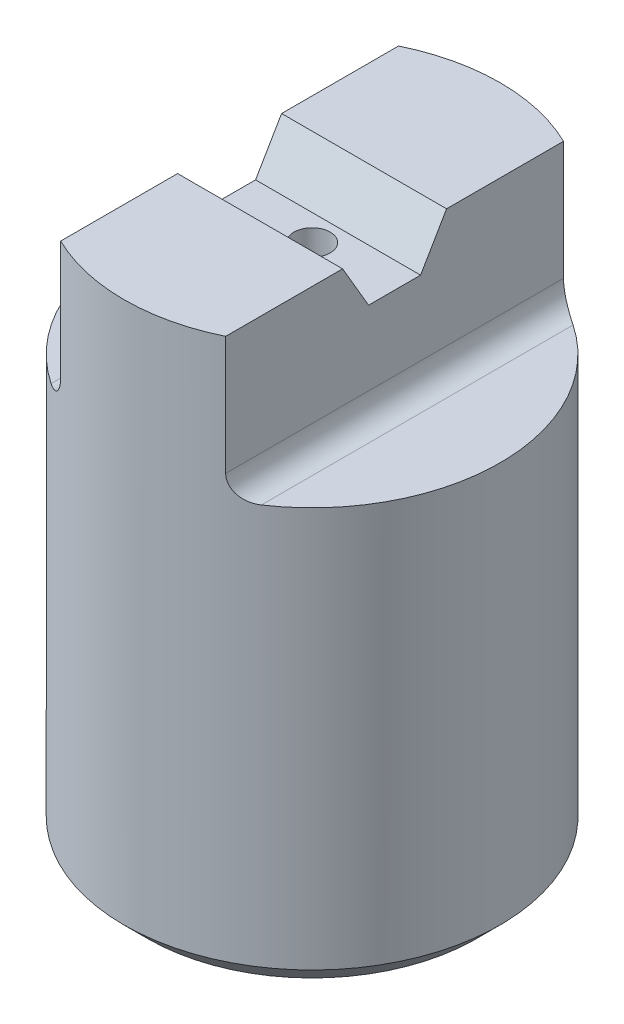
ISO-10303-21;
HEADER;
FILE_DESCRIPTION(('STEP AP214'),'2;1');
FILE_NAME('part.step','',(''),(''),'','','');
FILE_SCHEMA(('AUTOMOTIVE_DESIGN { 1 0 10303 214 1 1 1 1 }'));
ENDSEC;
DATA;
#1=APPLICATION_CONTEXT('core data for automotive mechanical design processes');
#2=APPLICATION_PROTOCOL_DEFINITION('international standard','automotive_design',2000,#1);
#3=PRODUCT_CONTEXT('',#1,'mechanical');
#4=PRODUCT('Part','Part','',(#3));
#5=PRODUCT_RELATED_PRODUCT_CATEGORY('part','',(#4));
#6=PRODUCT_DEFINITION_FORMATION('','',#4);
#7=PRODUCT_DEFINITION_CONTEXT('part definition',#1,'design');
#8=PRODUCT_DEFINITION('design','',#6,#7);
#9=PRODUCT_DEFINITION_SHAPE('','',#8);
#10=(LENGTH_UNIT() NAMED_UNIT(*) SI_UNIT(.MILLI.,.METRE.));
#11=(NAMED_UNIT(*) PLANE_ANGLE_UNIT() SI_UNIT($,.RADIAN.));
#12=(NAMED_UNIT(*) SI_UNIT($,.STERADIAN.) SOLID_ANGLE_UNIT());
#13=UNCERTAINTY_MEASURE_WITH_UNIT(LENGTH_MEASURE(1.E-05),#10,'distance_accuracy_value','');
#14=(GEOMETRIC_REPRESENTATION_CONTEXT(3) GLOBAL_UNCERTAINTY_ASSIGNED_CONTEXT((#13)) GLOBAL_UNIT_ASSIGNED_CONTEXT((#10,
#11,#12)) REPRESENTATION_CONTEXT('',''));
#15=CARTESIAN_POINT('',(0.,0.,0.));
#16=DIRECTION('',(0.,0.,1.));
#17=DIRECTION('',(1.,0.,0.));
#18=AXIS2_PLACEMENT_3D('',#15,#16,#17);
#19=CARTESIAN_POINT('',(0.,38.1,0.));
#20=DIRECTION('',(0.,1.,0.));
#21=DIRECTION('',(0.,0.,1.));
#22=AXIS2_PLACEMENT_3D('',#19,#20,#21);
#23=PLANE('',#22);
#24=DIRECTION('',(0.,0.,1.));
#25=VECTOR('',#24,1.);
#26=CARTESIAN_POINT('',(-5.5626,38.1,-12.6746));
#27=LINE('',#26,#25);
#28=CARTESIAN_POINT('',(-5.5626,38.1,3.50519999999999));
#29=VERTEX_POINT('',#28);
#30=CARTESIAN_POINT('',(-5.5626,38.1,11.3887210168658));
#31=VERTEX_POINT('',#30);
#32=EDGE_CURVE('E223',#29,#31,#27,.T.);
#33=ORIENTED_EDGE('',*,*,#32,.T.);
#34=CARTESIAN_POINT('',(0.,38.1,0.));
#35=DIRECTION('',(0.,1.,0.));
#36=DIRECTION('',(0.,0.,1.));
#37=AXIS2_PLACEMENT_3D('',#34,#35,#36);
#38=CIRCLE('',#37,12.6746);
#39=CARTESIAN_POINT('',(5.5626,38.1,11.3887210168658));
#40=VERTEX_POINT('',#39);
#41=EDGE_CURVE('E146',#31,#40,#38,.T.);
#42=ORIENTED_EDGE('',*,*,#41,.T.);
#43=DIRECTION('',(0.,0.,1.));
#44=VECTOR('',#43,1.);
#45=CARTESIAN_POINT('',(5.5626,38.1,-12.6746));
#46=LINE('',#45,#44);
#47=CARTESIAN_POINT('',(5.5626,38.1,3.50519999999998));
#48=VERTEX_POINT('',#47);
#49=EDGE_CURVE('E139',#48,#40,#46,.T.);
#50=ORIENTED_EDGE('',*,*,#49,.F.);
#51=DIRECTION('',(1.,0.,0.));
#52=VECTOR('',#51,1.);
#53=CARTESIAN_POINT('',(0.,38.1,3.5052));
#54=LINE('',#53,#52);
#55=EDGE_CURVE('E148',#29,#48,#54,.T.);
#56=ORIENTED_EDGE('',*,*,#55,.F.);
#57=EDGE_LOOP('',(#33,#42,#50,#56));
#58=FACE_BOUND('',#57,.T.);
#59=ADVANCED_FACE('F42',(#58),#23,.T.);
#60=CARTESIAN_POINT('',(0.,38.1,0.));
#61=DIRECTION('',(0.,-1.,0.));
#62=DIRECTION('',(0.,0.,-1.));
#63=AXIS2_PLACEMENT_3D('',#60,#61,#62);
#64=CYLINDRICAL_SURFACE('',#63,12.6746);
#65=CARTESIAN_POINT('',(0.,1.58750000000002,0.));
#66=DIRECTION('',(0.,1.,0.));
#67=DIRECTION('',(0.,0.,1.));
#68=AXIS2_PLACEMENT_3D('',#65,#66,#67);
#69=CIRCLE('',#68,12.6746);
#70=CARTESIAN_POINT('',(0.,1.58750000000002,12.6746));
#71=VERTEX_POINT('',#70);
#72=EDGE_CURVE('E52',#71,#71,#69,.T.);
#73=ORIENTED_EDGE('',*,*,#72,.T.);
#74=EDGE_LOOP('',(#73));
#75=FACE_BOUND('',#74,.T.);
#76=ORIENTED_EDGE('',*,*,#41,.F.);
#77=DIRECTION('',(0.,-1.,0.));
#78=VECTOR('',#77,1.);
#79=CARTESIAN_POINT('',(-5.5626,38.1,11.3887210168658));
#80=LINE('',#79,#78);
#81=CARTESIAN_POINT('',(-5.5626,30.099,11.3887210168658));
#82=VERTEX_POINT('',#81);
#83=EDGE_CURVE('E232',#31,#82,#80,.T.);
#84=ORIENTED_EDGE('',*,*,#83,.T.);
#85=CARTESIAN_POINT('',(-5.5626,30.099,11.3887210168658));
#86=CARTESIAN_POINT('',(-5.56259833638451,30.059515767015,11.3887205754779));
#87=CARTESIAN_POINT('',(-5.56413560332817,30.0200513689779,11.3879711119941));
#88=CARTESIAN_POINT('',(-5.57025538050498,29.9414242916359,11.3849794667979));
#89=CARTESIAN_POINT('',(-5.57483727345219,29.9022615527988,11.3827375876666));
#90=CARTESIAN_POINT('',(-5.59305475937112,29.7858959670763,11.3738039865226));
#91=CARTESIAN_POINT('',(-5.61116273729264,29.7095059860519,11.3649041725664));
#92=CARTESIAN_POINT('',(-5.65849678227894,29.5612633666685,11.341410256651));
#93=CARTESIAN_POINT('',(-5.68771997519488,29.4894095609505,11.3268176267032));
#94=CARTESIAN_POINT('',(-5.75604501274824,29.3519443853424,11.292249187289));
#95=CARTESIAN_POINT('',(-5.79515131147731,29.2863358484557,11.2722709503803));
#96=CARTESIAN_POINT('',(-5.88308811332943,29.1608124494378,11.2266327218898));
#97=CARTESIAN_POINT('',(-5.93219013494768,29.1011475010108,11.2008111347938));
#98=CARTESIAN_POINT('',(-6.03742774124639,28.991020163794,11.1444386632707));
#99=CARTESIAN_POINT('',(-6.09356354650025,28.9405580637194,11.1138876305251));
#100=CARTESIAN_POINT('',(-6.21652492068628,28.8451470604476,11.0456182066125));
#101=CARTESIAN_POINT('',(-6.28385904090425,28.8011429423719,11.0074979274901));
#102=CARTESIAN_POINT('',(-6.42267729153823,28.7249285891421,10.927083790395));
#103=CARTESIAN_POINT('',(-6.49416792756039,28.6927374520347,10.8847833131863));
#104=CARTESIAN_POINT('',(-6.65217713755734,28.6354097201875,10.7890664624693));
#105=CARTESIAN_POINT('',(-6.73912532568312,28.6125133442687,10.7350042920762));
#106=CARTESIAN_POINT('',(-6.86970618567764,28.5898660744945,10.6515401158691));
#107=CARTESIAN_POINT('',(-6.91320985678746,28.584266280002,10.6233570629947));
#108=CARTESIAN_POINT('',(-7.00006441283988,28.5768368460138,10.5663276854651));
#109=CARTESIAN_POINT('',(-7.04341538014501,28.5750047019154,10.537481814335));
#110=CARTESIAN_POINT('',(-7.0866,28.575,10.5083578926491));
#111=B_SPLINE_CURVE_WITH_KNOTS('',3,(#85,#86,#87,#88,#89,#90,#91,#92,#93,#94,#95,#96,#97,#98,
#99,#100,#101,#102,#103,#104,#105,#106,#107,#108,#109,#110),.UNSPECIFIED.,.F.,.F.,(4,2,2,2,2,2,
2,2,2,2,2,2,4),(0.,0.118376723226393,0.236729453358002,0.472517961760287,0.708245541870998,
0.944079549098627,1.1874729457039,1.43087397682821,1.69683953271511,1.96323320027045,
2.27653340150419,2.4328273576759,2.5890173814408),.UNSPECIFIED.);
#112=CARTESIAN_POINT('',(-7.0866,28.575,10.5083578926491));
#113=VERTEX_POINT('',#112);
#114=EDGE_CURVE('E270',#82,#113,#111,.T.);
#115=ORIENTED_EDGE('',*,*,#114,.T.);
#116=CARTESIAN_POINT('',(0.,28.575,0.));
#117=DIRECTION('',(0.,-1.,0.));
#118=DIRECTION('',(1.,0.,0.));
#119=AXIS2_PLACEMENT_3D('',#116,#117,#118);
#120=CIRCLE('',#119,12.6746);
#121=CARTESIAN_POINT('',(-7.0866,28.575,-10.5083578926491));
#122=VERTEX_POINT('',#121);
#123=EDGE_CURVE('E267',#113,#122,#120,.T.);
#124=ORIENTED_EDGE('',*,*,#123,.T.);
#125=CARTESIAN_POINT('',(-7.0866,28.575,-10.5083578926491));
#126=CARTESIAN_POINT('',(-7.03284130686239,28.5749999917076,-10.5446189155192));
#127=CARTESIAN_POINT('',(-6.97878106168281,28.5778454608532,-10.580468507141));
#128=CARTESIAN_POINT('',(-6.87048486278435,28.5894168850708,-10.651106419884));
#129=CARTESIAN_POINT('',(-6.81624876727833,28.598151595978,-10.6858930800772));
#130=CARTESIAN_POINT('',(-6.70798914272899,28.6217362112059,-10.7541845715569));
#131=CARTESIAN_POINT('',(-6.65396717063229,28.6366088965979,-10.7876841139555));
#132=CARTESIAN_POINT('',(-6.5470188162544,28.672601753039,-10.852923770536));
#133=CARTESIAN_POINT('',(-6.49409164261747,28.6937172297943,-10.884665185531));
#134=CARTESIAN_POINT('',(-6.36588211082076,28.7535666299149,-10.960329132554));
#135=CARTESIAN_POINT('',(-6.29156872215907,28.7959332982983,-11.0031042762727));
#136=CARTESIAN_POINT('',(-6.14940442969504,28.8941404291546,-11.0831839505768));
#137=CARTESIAN_POINT('',(-6.08153932056011,28.9499502697824,-11.1205006087666));
#138=CARTESIAN_POINT('',(-5.95452247637238,29.0748160674812,-11.1890300303333));
#139=CARTESIAN_POINT('',(-5.8954288225175,29.1439539063532,-11.2202025191228));
#140=CARTESIAN_POINT('',(-5.78948590066053,29.2937221536138,-11.2752349871294));
#141=CARTESIAN_POINT('',(-5.74264016011602,29.374355862558,-11.2990928600431));
#142=CARTESIAN_POINT('',(-5.66825012242804,29.5352154478988,-11.3365768771207));
#143=CARTESIAN_POINT('',(-5.63916479372903,29.614539499369,-11.3510313651414));
#144=CARTESIAN_POINT('',(-5.5944662508826,29.7777071267501,-11.3731292161673));
#145=CARTESIAN_POINT('',(-5.57882209477686,29.8615398478591,-11.3807882238962));
#146=CARTESIAN_POINT('',(-5.56772429167455,29.9715216320686,-11.3862168065965));
#147=CARTESIAN_POINT('',(-5.56580237104648,29.996990583067,-11.387156340307));
#148=CARTESIAN_POINT('',(-5.56324214096757,30.0479689785512,-11.3884075143877));
#149=CARTESIAN_POINT('',(-5.56260185827255,30.0734783001781,-11.3887201199946));
#150=CARTESIAN_POINT('',(-5.56259999999999,30.099,-11.3887210168659));
#151=B_SPLINE_CURVE_WITH_KNOTS('',3,(#125,#126,#127,#128,#129,#130,#131,#132,#133,#134,#135,
#136,#137,#138,#139,#140,#141,#142,#143,#144,#145,#146,#147,#148,#149,#150),.UNSPECIFIED.,.F.,
.F.,(4,2,2,2,2,2,2,2,2,2,2,2,4),(0.,0.194499746734342,0.389289305653212,0.584808421543954,
0.780180888319562,1.06581600208983,1.35080652783429,1.63760718336099,1.92449034808457,
2.18029987365551,2.43551892847972,2.51216747465927,2.58869791962831),.UNSPECIFIED.);
#152=CARTESIAN_POINT('',(-5.5626,30.099,-11.3887210168658));
#153=VERTEX_POINT('',#152);
#154=EDGE_CURVE('E269',#122,#153,#151,.T.);
#155=ORIENTED_EDGE('',*,*,#154,.T.);
#156=DIRECTION('',(0.,-1.,0.));
#157=VECTOR('',#156,1.);
#158=CARTESIAN_POINT('',(-5.5626,38.1,-11.3887210168658));
#159=LINE('',#158,#157);
#160=CARTESIAN_POINT('',(-5.5626,38.1,-11.3887210168658));
#161=VERTEX_POINT('',#160);
#162=EDGE_CURVE('E145',#153,#161,#159,.F.);
#163=ORIENTED_EDGE('',*,*,#162,.T.);
#164=CARTESIAN_POINT('',(5.5626,38.1,-11.3887210168658));
#165=VERTEX_POINT('',#164);
#166=EDGE_CURVE('E135',#165,#161,#38,.T.);
#167=ORIENTED_EDGE('',*,*,#166,.F.);
#168=DIRECTION('',(0.,-1.,0.));
#169=VECTOR('',#168,1.);
#170=CARTESIAN_POINT('',(5.5626,38.1,-11.3887210168658));
#171=LINE('',#170,#169);
#172=CARTESIAN_POINT('',(5.5626,30.099,-11.3887210168658));
#173=VERTEX_POINT('',#172);
#174=EDGE_CURVE('E121',#165,#173,#171,.T.);
#175=ORIENTED_EDGE('',*,*,#174,.T.);
#176=CARTESIAN_POINT('',(5.56259999999999,30.099,-11.3887210168658));
#177=CARTESIAN_POINT('',(5.56259833638451,30.059515767015,-11.3887205754778));
#178=CARTESIAN_POINT('',(5.56413560332816,30.0200513689778,-11.3879711119941));
#179=CARTESIAN_POINT('',(5.57025538050497,29.9414242916359,-11.3849794667979));
#180=CARTESIAN_POINT('',(5.57483727345218,29.9022615527988,-11.3827375876666));
#181=CARTESIAN_POINT('',(5.59305475937111,29.7858959670763,-11.3738039865226));
#182=CARTESIAN_POINT('',(5.61116273729264,29.7095059860518,-11.3649041725664));
#183=CARTESIAN_POINT('',(5.65849678227894,29.5612633666685,-11.341410256651));
#184=CARTESIAN_POINT('',(5.68771997519487,29.4894095609505,-11.3268176267032));
#185=CARTESIAN_POINT('',(5.75604501274823,29.3519443853424,-11.292249187289));
#186=CARTESIAN_POINT('',(5.7951513114773,29.2863358484557,-11.2722709503803));
#187=CARTESIAN_POINT('',(5.88308811332942,29.1608124494378,-11.2266327218898));
#188=CARTESIAN_POINT('',(5.93219013494768,29.1011475010108,-11.2008111347938));
#189=CARTESIAN_POINT('',(6.03742774124638,28.991020163794,-11.1444386632707));
#190=CARTESIAN_POINT('',(6.09356354650024,28.9405580637194,-11.1138876305251));
#191=CARTESIAN_POINT('',(6.21652492068628,28.8451470604476,-11.0456182066125));
#192=CARTESIAN_POINT('',(6.28385904090425,28.8011429423718,-11.0074979274902));
#193=CARTESIAN_POINT('',(6.42267729153823,28.7249285891421,-10.927083790395));
#194=CARTESIAN_POINT('',(6.49416792756039,28.6927374520347,-10.8847833131863));
#195=CARTESIAN_POINT('',(6.65217713755733,28.6354097201874,-10.7890664624693));
#196=CARTESIAN_POINT('',(6.73912532568312,28.6125133442687,-10.7350042920762));
#197=CARTESIAN_POINT('',(6.86970618567764,28.5898660744945,-10.6515401158691));
#198=CARTESIAN_POINT('',(6.91320985678746,28.584266280002,-10.6233570629947));
#199=CARTESIAN_POINT('',(7.00006441283988,28.5768368460138,-10.5663276854651));
#200=CARTESIAN_POINT('',(7.04341538014501,28.5750047019154,-10.537481814335));
#201=CARTESIAN_POINT('',(7.0866,28.575,-10.5083578926491));
#202=B_SPLINE_CURVE_WITH_KNOTS('',3,(#176,#177,#178,#179,#180,#181,#182,#183,#184,#185,#186,
#187,#188,#189,#190,#191,#192,#193,#194,#195,#196,#197,#198,#199,#200,#201),.UNSPECIFIED.,.F.,
.F.,(4,2,2,2,2,2,2,2,2,2,2,2,4),(0.,0.118376723226393,0.236729453358002,0.472517961760287,
0.708245541870998,0.944079549098627,1.1874729457039,1.43087397682821,1.69683953271511,
1.96323320027045,2.27653340150419,2.4328273576759,2.5890173814408),.UNSPECIFIED.);
#203=CARTESIAN_POINT('',(7.0866,28.575,-10.5083578926491));
#204=VERTEX_POINT('',#203);
#205=EDGE_CURVE('E164',#173,#204,#202,.T.);
#206=ORIENTED_EDGE('',*,*,#205,.T.);
#207=CARTESIAN_POINT('',(0.,28.575,0.));
#208=DIRECTION('',(0.,-1.,0.));
#209=DIRECTION('',(1.,0.,0.));
#210=AXIS2_PLACEMENT_3D('',#207,#208,#209);
#211=CIRCLE('',#210,12.6746);
#212=CARTESIAN_POINT('',(7.0866,28.575,10.5083578926491));
#213=VERTEX_POINT('',#212);
#214=EDGE_CURVE('E162',#204,#213,#211,.T.);
#215=ORIENTED_EDGE('',*,*,#214,.T.);
#216=CARTESIAN_POINT('',(7.0866,28.575,10.5083578926491));
#217=CARTESIAN_POINT('',(7.03284130686239,28.5749999917076,10.5446189155192));
#218=CARTESIAN_POINT('',(6.97878106168281,28.5778454608532,10.580468507141));
#219=CARTESIAN_POINT('',(6.87048486278435,28.5894168850708,10.6511064198841));
#220=CARTESIAN_POINT('',(6.81624876727832,28.5981515959779,10.6858930800772));
#221=CARTESIAN_POINT('',(6.70798914272898,28.6217362112059,10.7541845715569));
#222=CARTESIAN_POINT('',(6.65396717063228,28.6366088965979,10.7876841139555));
#223=CARTESIAN_POINT('',(6.54701881625439,28.672601753039,10.852923770536));
#224=CARTESIAN_POINT('',(6.49409164261747,28.6937172297943,10.884665185531));
#225=CARTESIAN_POINT('',(6.36588211082075,28.7535666299149,10.960329132554));
#226=CARTESIAN_POINT('',(6.29156872215906,28.7959332982983,11.0031042762727));
#227=CARTESIAN_POINT('',(6.14940442969503,28.8941404291546,11.0831839505768));
#228=CARTESIAN_POINT('',(6.0815393205601,28.9499502697824,11.1205006087666));
#229=CARTESIAN_POINT('',(5.95452247637238,29.0748160674812,11.1890300303333));
#230=CARTESIAN_POINT('',(5.89542882251749,29.1439539063532,11.2202025191228));
#231=CARTESIAN_POINT('',(5.78948590066052,29.2937221536137,11.2752349871294));
#232=CARTESIAN_POINT('',(5.74264016011601,29.374355862558,11.2990928600431));
#233=CARTESIAN_POINT('',(5.66825012242804,29.5352154478988,11.3365768771207));
#234=CARTESIAN_POINT('',(5.63916479372902,29.614539499369,11.3510313651414));
#235=CARTESIAN_POINT('',(5.59446625088259,29.7777071267501,11.3731292161673));
#236=CARTESIAN_POINT('',(5.57882209477686,29.8615398478591,11.3807882238962));
#237=CARTESIAN_POINT('',(5.56772429167454,29.9715216320686,11.3862168065965));
#238=CARTESIAN_POINT('',(5.56580237104647,29.9969905830669,11.387156340307));
#239=CARTESIAN_POINT('',(5.56324214096756,30.0479689785512,11.3884075143877));
#240=CARTESIAN_POINT('',(5.56260185827254,30.0734783001781,11.3887201199946));
#241=CARTESIAN_POINT('',(5.56259999999998,30.099,11.3887210168659));
#242=B_SPLINE_CURVE_WITH_KNOTS('',3,(#216,#217,#218,#219,#220,#221,#222,#223,#224,#225,#226,
#227,#228,#229,#230,#231,#232,#233,#234,#235,#236,#237,#238,#239,#240,#241),.UNSPECIFIED.,.F.,
.F.,(4,2,2,2,2,2,2,2,2,2,2,2,4),(0.,0.194499746734344,0.389289305653213,0.584808421543954,
0.780180888319564,1.06581600208983,1.35080652783429,1.63760718336099,1.92449034808457,
2.18029987365551,2.43551892847972,2.51216747465927,2.5886979196283),.UNSPECIFIED.);
#243=CARTESIAN_POINT('',(5.5626,30.099,11.3887210168658));
#244=VERTEX_POINT('',#243);
#245=EDGE_CURVE('E171',#213,#244,#242,.T.);
#246=ORIENTED_EDGE('',*,*,#245,.T.);
#247=DIRECTION('',(0.,-1.,0.));
#248=VECTOR('',#247,1.);
#249=CARTESIAN_POINT('',(5.5626,38.1,11.3887210168658));
#250=LINE('',#249,#248);
#251=EDGE_CURVE('E128',#244,#40,#250,.F.);
#252=ORIENTED_EDGE('',*,*,#251,.T.);
#253=EDGE_LOOP('',(#76,#84,#115,#124,#155,#163,#167,#175,#206,#215,#246,#252));
#254=FACE_BOUND('',#253,.T.);
#255=ADVANCED_FACE('F143',(#75,#254),#64,.T.);
#256=CARTESIAN_POINT('',(-5.5626,38.1,-3.5052));
#257=VERTEX_POINT('',#256);
#258=EDGE_CURVE('E226',#161,#257,#27,.T.);
#259=ORIENTED_EDGE('',*,*,#258,.T.);
#260=DIRECTION('',(-1.,0.,0.));
#261=VECTOR('',#260,1.);
#262=CARTESIAN_POINT('',(0.,38.1,-3.5052));
#263=LINE('',#262,#261);
#264=CARTESIAN_POINT('',(5.5626,38.1,-3.5052));
#265=VERTEX_POINT('',#264);
#266=EDGE_CURVE('E137',#265,#257,#263,.T.);
#267=ORIENTED_EDGE('',*,*,#266,.F.);
#268=EDGE_CURVE('E60',#165,#265,#46,.T.);
#269=ORIENTED_EDGE('',*,*,#268,.F.);
#270=ORIENTED_EDGE('',*,*,#166,.T.);
#271=EDGE_LOOP('',(#259,#267,#269,#270));
#272=FACE_BOUND('',#271,.T.);
#273=ADVANCED_FACE('F134',(#272),#23,.T.);
#274=CARTESIAN_POINT('',(0.,0.,0.));
#275=DIRECTION('',(0.,1.,0.));
#276=DIRECTION('',(0.,0.,1.));
#277=AXIS2_PLACEMENT_3D('',#274,#275,#276);
#278=PLANE('',#277);
#279=CARTESIAN_POINT('',(0.,0.,0.));
#280=DIRECTION('',(0.,-1.,0.));
#281=DIRECTION('',(0.,0.,-1.));
#282=AXIS2_PLACEMENT_3D('',#279,#280,#281);
#283=CIRCLE('',#282,1.72719999999999);
#284=CARTESIAN_POINT('',(0.,0.,-1.72719999999999));
#285=VERTEX_POINT('',#284);
#286=EDGE_CURVE('E306',#285,#285,#283,.T.);
#287=ORIENTED_EDGE('',*,*,#286,.F.);
#288=EDGE_LOOP('',(#287));
#289=FACE_BOUND('',#288,.T.);
#290=CARTESIAN_POINT('',(0.,0.,0.));
#291=DIRECTION('',(0.,1.,0.));
#292=DIRECTION('',(0.,0.,1.));
#293=AXIS2_PLACEMENT_3D('',#290,#291,#292);
#294=CIRCLE('',#293,11.0871);
#295=CARTESIAN_POINT('',(0.,0.,11.0871));
#296=VERTEX_POINT('',#295);
#297=EDGE_CURVE('E11',#296,#296,#294,.F.);
#298=ORIENTED_EDGE('',*,*,#297,.T.);
#299=EDGE_LOOP('',(#298));
#300=FACE_BOUND('',#299,.T.);
#301=ADVANCED_FACE('F203',(#289,#300),#278,.F.);
#302=CARTESIAN_POINT('',(-12.6746,35.1028,-1.7526));
#303=DIRECTION('',(0.,-1.,0.));
#304=DIRECTION('',(0.,0.,-1.));
#305=AXIS2_PLACEMENT_3D('',#302,#303,#304);
#306=PLANE('',#305);
#307=CARTESIAN_POINT('',(0.,35.1028,0.));
#308=DIRECTION('',(0.,-1.,0.));
#309=DIRECTION('',(0.,0.,-1.));
#310=AXIS2_PLACEMENT_3D('',#307,#308,#309);
#311=CIRCLE('',#310,1.2192);
#312=CARTESIAN_POINT('',(0.,35.1028,-1.2192));
#313=VERTEX_POINT('',#312);
#314=EDGE_CURVE('E252',#313,#313,#311,.T.);
#315=ORIENTED_EDGE('',*,*,#314,.T.);
#316=EDGE_LOOP('',(#315));
#317=FACE_BOUND('',#316,.T.);
#318=DIRECTION('',(1.,0.,0.));
#319=VECTOR('',#318,1.);
#320=CARTESIAN_POINT('',(-12.6746,35.1028,-1.7526));
#321=LINE('',#320,#319);
#322=CARTESIAN_POINT('',(-5.5626,35.1028,-1.7526));
#323=VERTEX_POINT('',#322);
#324=CARTESIAN_POINT('',(5.5626,35.1028,-1.7526));
#325=VERTEX_POINT('',#324);
#326=EDGE_CURVE('E151',#323,#325,#321,.T.);
#327=ORIENTED_EDGE('',*,*,#326,.F.);
#328=DIRECTION('',(0.,0.,1.));
#329=VECTOR('',#328,1.);
#330=CARTESIAN_POINT('',(-5.5626,35.1028,-1.7526));
#331=LINE('',#330,#329);
#332=CARTESIAN_POINT('',(-5.5626,35.1028,1.7526));
#333=VERTEX_POINT('',#332);
#334=EDGE_CURVE('E68',#323,#333,#331,.T.);
#335=ORIENTED_EDGE('',*,*,#334,.T.);
#336=DIRECTION('',(1.,0.,0.));
#337=VECTOR('',#336,1.);
#338=CARTESIAN_POINT('',(-12.6746,35.1028,1.7526));
#339=LINE('',#338,#337);
#340=CARTESIAN_POINT('',(5.5626,35.1028,1.7526));
#341=VERTEX_POINT('',#340);
#342=EDGE_CURVE('E153',#333,#341,#339,.T.);
#343=ORIENTED_EDGE('',*,*,#342,.T.);
#344=DIRECTION('',(0.,0.,-1.));
#345=VECTOR('',#344,1.);
#346=CARTESIAN_POINT('',(5.5626,35.1028,-1.7526));
#347=LINE('',#346,#345);
#348=EDGE_CURVE('E238',#341,#325,#347,.T.);
#349=ORIENTED_EDGE('',*,*,#348,.T.);
#350=EDGE_LOOP('',(#327,#335,#343,#349));
#351=FACE_BOUND('',#350,.T.);
#352=ADVANCED_FACE('F200',(#317,#351),#306,.F.);
#353=CARTESIAN_POINT('',(-12.6746,35.1028,1.7526));
#354=DIRECTION('',(0.,-0.50478046532097,0.863247752288035));
#355=DIRECTION('',(0.,-0.863247752288035,-0.50478046532097));
#356=AXIS2_PLACEMENT_3D('',#353,#354,#355);
#357=PLANE('',#356);
#358=ORIENTED_EDGE('',*,*,#342,.F.);
#359=DIRECTION('',(0.,0.863247752288035,0.50478046532097));
#360=VECTOR('',#359,1.);
#361=CARTESIAN_POINT('',(-5.5626,35.1028,1.7526));
#362=LINE('',#361,#360);
#363=EDGE_CURVE('E243',#333,#29,#362,.T.);
#364=ORIENTED_EDGE('',*,*,#363,.T.);
#365=ORIENTED_EDGE('',*,*,#55,.T.);
#366=DIRECTION('',(0.,-0.863247752288035,-0.50478046532097));
#367=VECTOR('',#366,1.);
#368=CARTESIAN_POINT('',(5.5626,35.1028,1.7526));
#369=LINE('',#368,#367);
#370=EDGE_CURVE('E235',#48,#341,#369,.T.);
#371=ORIENTED_EDGE('',*,*,#370,.T.);
#372=EDGE_LOOP('',(#358,#364,#365,#371));
#373=FACE_BOUND('',#372,.T.);
#374=ADVANCED_FACE('F198',(#373),#357,.F.);
#375=CARTESIAN_POINT('',(-12.6746,38.1,-3.5052));
#376=DIRECTION('',(0.,-0.50478046532097,-0.863247752288035));
#377=DIRECTION('',(0.,0.863247752288035,-0.50478046532097));
#378=AXIS2_PLACEMENT_3D('',#375,#376,#377);
#379=PLANE('',#378);
#380=ORIENTED_EDGE('',*,*,#266,.T.);
#381=DIRECTION('',(0.,-0.863247752288035,0.50478046532097));
#382=VECTOR('',#381,1.);
#383=CARTESIAN_POINT('',(-5.5626,38.1,-3.5052));
#384=LINE('',#383,#382);
#385=EDGE_CURVE('E160',#257,#323,#384,.T.);
#386=ORIENTED_EDGE('',*,*,#385,.T.);
#387=ORIENTED_EDGE('',*,*,#326,.T.);
#388=DIRECTION('',(0.,0.863247752288035,-0.50478046532097));
#389=VECTOR('',#388,1.);
#390=CARTESIAN_POINT('',(5.5626,38.1,-3.5052));
#391=LINE('',#390,#389);
#392=EDGE_CURVE('E158',#325,#265,#391,.T.);
#393=ORIENTED_EDGE('',*,*,#392,.T.);
#394=EDGE_LOOP('',(#380,#386,#387,#393));
#395=FACE_BOUND('',#394,.T.);
#396=ADVANCED_FACE('F185',(#395),#379,.F.);
#397=CARTESIAN_POINT('',(7.0866,30.099,-12.6746));
#398=DIRECTION('',(0.,0.,1.));
#399=DIRECTION('',(1.,0.,0.));
#400=AXIS2_PLACEMENT_3D('',#397,#398,#399);
#401=CYLINDRICAL_SURFACE('',#400,1.524);
#402=DIRECTION('',(0.,0.,1.));
#403=VECTOR('',#402,1.);
#404=CARTESIAN_POINT('',(7.0866,28.575,-12.6746));
#405=LINE('',#404,#403);
#406=EDGE_CURVE('E138',#204,#213,#405,.T.);
#407=ORIENTED_EDGE('',*,*,#406,.F.);
#408=ORIENTED_EDGE('',*,*,#205,.F.);
#409=DIRECTION('',(0.,0.,1.));
#410=VECTOR('',#409,1.);
#411=CARTESIAN_POINT('',(5.5626,30.099,-12.6746));
#412=LINE('',#411,#410);
#413=EDGE_CURVE('E124',#173,#244,#412,.T.);
#414=ORIENTED_EDGE('',*,*,#413,.T.);
#415=ORIENTED_EDGE('',*,*,#245,.F.);
#416=EDGE_LOOP('',(#407,#408,#414,#415));
#417=FACE_BOUND('',#416,.T.);
#418=ADVANCED_FACE('F179',(#417),#401,.F.);
#419=CARTESIAN_POINT('',(12.6746,28.575,-12.6746));
#420=DIRECTION('',(0.,-1.,0.));
#421=DIRECTION('',(1.,0.,0.));
#422=AXIS2_PLACEMENT_3D('',#419,#420,#421);
#423=PLANE('',#422);
#424=ORIENTED_EDGE('',*,*,#214,.F.);
#425=ORIENTED_EDGE('',*,*,#406,.T.);
#426=EDGE_LOOP('',(#424,#425));
#427=FACE_BOUND('',#426,.T.);
#428=ADVANCED_FACE('F184',(#427),#423,.F.);
#429=CARTESIAN_POINT('',(5.5626,30.099,-12.6746));
#430=DIRECTION('',(-1.,0.,0.));
#431=DIRECTION('',(0.,-1.,0.));
#432=AXIS2_PLACEMENT_3D('',#429,#430,#431);
#433=PLANE('',#432);
#434=ORIENTED_EDGE('',*,*,#268,.T.);
#435=ORIENTED_EDGE('',*,*,#392,.F.);
#436=ORIENTED_EDGE('',*,*,#348,.F.);
#437=ORIENTED_EDGE('',*,*,#370,.F.);
#438=ORIENTED_EDGE('',*,*,#49,.T.);
#439=ORIENTED_EDGE('',*,*,#251,.F.);
#440=ORIENTED_EDGE('',*,*,#413,.F.);
#441=ORIENTED_EDGE('',*,*,#174,.F.);
#442=EDGE_LOOP('',(#434,#435,#436,#437,#438,#439,#440,#441));
#443=FACE_BOUND('',#442,.T.);
#444=ADVANCED_FACE('F122',(#443),#433,.F.);
#445=CARTESIAN_POINT('',(-7.0866,30.099,-12.6746));
#446=DIRECTION('',(0.,0.,1.));
#447=DIRECTION('',(1.,0.,0.));
#448=AXIS2_PLACEMENT_3D('',#445,#446,#447);
#449=CYLINDRICAL_SURFACE('',#448,1.524);
#450=DIRECTION('',(0.,0.,1.));
#451=VECTOR('',#450,1.);
#452=CARTESIAN_POINT('',(-5.5626,30.099,-12.6746));
#453=LINE('',#452,#451);
#454=EDGE_CURVE('E227',#153,#82,#453,.T.);
#455=ORIENTED_EDGE('',*,*,#454,.F.);
#456=ORIENTED_EDGE('',*,*,#154,.F.);
#457=DIRECTION('',(0.,0.,1.));
#458=VECTOR('',#457,1.);
#459=CARTESIAN_POINT('',(-7.0866,28.575,-12.6746));
#460=LINE('',#459,#458);
#461=EDGE_CURVE('E261',#122,#113,#460,.T.);
#462=ORIENTED_EDGE('',*,*,#461,.T.);
#463=ORIENTED_EDGE('',*,*,#114,.F.);
#464=EDGE_LOOP('',(#455,#456,#462,#463));
#465=FACE_BOUND('',#464,.T.);
#466=ADVANCED_FACE('F195',(#465),#449,.F.);
#467=CARTESIAN_POINT('',(-12.6746,28.575,-12.6746));
#468=DIRECTION('',(0.,-1.,0.));
#469=DIRECTION('',(1.,0.,0.));
#470=AXIS2_PLACEMENT_3D('',#467,#468,#469);
#471=PLANE('',#470);
#472=ORIENTED_EDGE('',*,*,#461,.F.);
#473=ORIENTED_EDGE('',*,*,#123,.F.);
#474=EDGE_LOOP('',(#472,#473));
#475=FACE_BOUND('',#474,.T.);
#476=ADVANCED_FACE('F187',(#475),#471,.F.);
#477=CARTESIAN_POINT('',(-5.5626,30.099,-12.6746));
#478=DIRECTION('',(1.,0.,0.));
#479=DIRECTION('',(0.,1.,0.));
#480=AXIS2_PLACEMENT_3D('',#477,#478,#479);
#481=PLANE('',#480);
#482=ORIENTED_EDGE('',*,*,#32,.F.);
#483=ORIENTED_EDGE('',*,*,#363,.F.);
#484=ORIENTED_EDGE('',*,*,#334,.F.);
#485=ORIENTED_EDGE('',*,*,#385,.F.);
#486=ORIENTED_EDGE('',*,*,#258,.F.);
#487=ORIENTED_EDGE('',*,*,#162,.F.);
#488=ORIENTED_EDGE('',*,*,#454,.T.);
#489=ORIENTED_EDGE('',*,*,#83,.F.);
#490=EDGE_LOOP('',(#482,#483,#484,#485,#486,#487,#488,#489));
#491=FACE_BOUND('',#490,.T.);
#492=ADVANCED_FACE('F285',(#491),#481,.F.);
#493=CARTESIAN_POINT('',(0.,1.58750000000002,0.));
#494=DIRECTION('',(0.,1.,0.));
#495=DIRECTION('',(0.,0.,1.));
#496=AXIS2_PLACEMENT_3D('',#493,#494,#495);
#497=CONICAL_SURFACE('',#496,12.6746,0.785398163397449);
#498=ORIENTED_EDGE('',*,*,#297,.F.);
#499=EDGE_LOOP('',(#498));
#500=FACE_BOUND('',#499,.T.);
#501=ORIENTED_EDGE('',*,*,#72,.F.);
#502=EDGE_LOOP('',(#501));
#503=FACE_BOUND('',#502,.T.);
#504=ADVANCED_FACE('F45',(#500,#503),#497,.T.);
#505=CARTESIAN_POINT('',(0.,38.1,0.));
#506=DIRECTION('',(0.,-1.,0.));
#507=DIRECTION('',(0.,0.,-1.));
#508=AXIS2_PLACEMENT_3D('',#505,#506,#507);
#509=CYLINDRICAL_SURFACE('',#508,1.2192);
#510=CARTESIAN_POINT('',(0.,20.879237194466,0.));
#511=DIRECTION('',(0.,-1.,0.));
#512=DIRECTION('',(0.,0.,-1.));
#513=AXIS2_PLACEMENT_3D('',#510,#511,#512);
#514=CIRCLE('',#513,1.2192);
#515=CARTESIAN_POINT('',(0.,20.879237194466,-1.2192));
#516=VERTEX_POINT('',#515);
#517=EDGE_CURVE('E47',#516,#516,#514,.T.);
#518=CARTESIAN_POINT('',(0.,20.879237194466,-1.2192));
#519=CARTESIAN_POINT('',(0.,21.0273993070237,-1.2192));
#520=CARTESIAN_POINT('',(0.,21.1755614195813,-1.2192));
#521=CARTESIAN_POINT('',(0.,21.4718856446966,-1.2192));
#522=CARTESIAN_POINT('',(0.,21.6200477572542,-1.2192));
#523=CARTESIAN_POINT('',(0.,21.9163719823695,-1.2192));
#524=CARTESIAN_POINT('',(0.,22.0645340949272,-1.2192));
#525=CARTESIAN_POINT('',(0.,22.3608583200425,-1.2192));
#526=CARTESIAN_POINT('',(0.,22.5090204326001,-1.2192));
#527=CARTESIAN_POINT('',(0.,22.8053446577154,-1.2192));
#528=CARTESIAN_POINT('',(0.,22.953506770273,-1.2192));
#529=CARTESIAN_POINT('',(0.,23.2498309953883,-1.2192));
#530=CARTESIAN_POINT('',(0.,23.397993107946,-1.2192));
#531=CARTESIAN_POINT('',(0.,23.6943173330613,-1.2192));
#532=CARTESIAN_POINT('',(0.,23.8424794456189,-1.2192));
#533=CARTESIAN_POINT('',(0.,24.1388036707342,-1.2192));
#534=CARTESIAN_POINT('',(0.,24.2869657832919,-1.2192));
#535=CARTESIAN_POINT('',(0.,24.5832900084072,-1.2192));
#536=CARTESIAN_POINT('',(0.,24.7314521209648,-1.2192));
#537=CARTESIAN_POINT('',(0.,25.0277763460801,-1.2192));
#538=CARTESIAN_POINT('',(0.,25.1759384586377,-1.2192));
#539=CARTESIAN_POINT('',(0.,25.472262683753,-1.2192));
#540=CARTESIAN_POINT('',(0.,25.6204247963107,-1.2192));
#541=CARTESIAN_POINT('',(0.,25.916749021426,-1.2192));
#542=CARTESIAN_POINT('',(0.,26.0649111339836,-1.2192));
#543=CARTESIAN_POINT('',(0.,26.3612353590989,-1.2192));
#544=CARTESIAN_POINT('',(0.,26.5093974716565,-1.2192));
#545=CARTESIAN_POINT('',(0.,26.8057216967718,-1.2192));
#546=CARTESIAN_POINT('',(0.,26.9538838093295,-1.2192));
#547=CARTESIAN_POINT('',(0.,27.2502080344448,-1.2192));
#548=CARTESIAN_POINT('',(0.,27.3983701470024,-1.2192));
#549=CARTESIAN_POINT('',(0.,27.6946943721177,-1.2192));
#550=CARTESIAN_POINT('',(0.,27.8428564846754,-1.2192));
#551=CARTESIAN_POINT('',(0.,28.1391807097907,-1.2192));
#552=CARTESIAN_POINT('',(0.,28.2873428223483,-1.2192));
#553=CARTESIAN_POINT('',(0.,28.5836670474636,-1.2192));
#554=CARTESIAN_POINT('',(0.,28.7318291600212,-1.2192));
#555=CARTESIAN_POINT('',(0.,29.0281533851365,-1.2192));
#556=CARTESIAN_POINT('',(0.,29.1763154976942,-1.2192));
#557=CARTESIAN_POINT('',(0.,29.4726397228095,-1.2192));
#558=CARTESIAN_POINT('',(0.,29.6208018353671,-1.2192));
#559=CARTESIAN_POINT('',(0.,29.9171260604824,-1.2192));
#560=CARTESIAN_POINT('',(0.,30.06528817304,-1.2192));
#561=CARTESIAN_POINT('',(0.,30.3616123981553,-1.2192));
#562=CARTESIAN_POINT('',(0.,30.509774510713,-1.2192));
#563=CARTESIAN_POINT('',(0.,30.8060987358283,-1.2192));
#564=CARTESIAN_POINT('',(0.,30.9542608483859,-1.2192));
#565=CARTESIAN_POINT('',(0.,31.2505850735012,-1.2192));
#566=CARTESIAN_POINT('',(0.,31.3987471860589,-1.2192));
#567=CARTESIAN_POINT('',(0.,31.6950714111741,-1.2192));
#568=CARTESIAN_POINT('',(0.,31.8432335237318,-1.2192));
#569=CARTESIAN_POINT('',(0.,32.1395577488471,-1.2192));
#570=CARTESIAN_POINT('',(0.,32.2877198614047,-1.2192));
#571=CARTESIAN_POINT('',(0.,32.58404408652,-1.2192));
#572=CARTESIAN_POINT('',(0.,32.7322061990777,-1.2192));
#573=CARTESIAN_POINT('',(0.,33.028530424193,-1.2192));
#574=CARTESIAN_POINT('',(0.,33.1766925367506,-1.2192));
#575=CARTESIAN_POINT('',(0.,33.4730167618659,-1.2192));
#576=CARTESIAN_POINT('',(0.,33.6211788744235,-1.2192));
#577=CARTESIAN_POINT('',(0.,33.9175030995388,-1.2192));
#578=CARTESIAN_POINT('',(0.,34.0656652120965,-1.2192));
#579=CARTESIAN_POINT('',(0.,34.3619894372118,-1.2192));
#580=CARTESIAN_POINT('',(0.,34.5101515497694,-1.2192));
#581=CARTESIAN_POINT('',(0.,34.8064757748847,-1.2192));
#582=CARTESIAN_POINT('',(0.,34.9546378874424,-1.2192));
#583=CARTESIAN_POINT('',(0.,35.1028,-1.2192));
#584=B_SPLINE_CURVE_WITH_KNOTS('',3,(#518,#519,#520,#521,#522,#523,#524,#525,#526,#527,#528,
#529,#530,#531,#532,#533,#534,#535,#536,#537,#538,#539,#540,#541,#542,#543,#544,#545,#546,#547,
#548,#549,#550,#551,#552,#553,#554,#555,#556,#557,#558,#559,#560,#561,#562,#563,#564,#565,#566,
#567,#568,#569,#570,#571,#572,#573,#574,#575,#576,#577,#578,#579,#580,#581,#582,#583),
.UNSPECIFIED.,.F.,.F.,(4,2,2,2,2,2,2,2,2,2,2,2,2,2,2,2,2,2,2,2,2,2,2,2,2,2,2,2,2,2,2,2,4),(0.,
0.444486337672939,0.888972675345875,1.33345901301881,1.77794535069175,2.22243168836469,
2.66691802603762,3.11140436371056,3.5558907013835,4.00037703905643,4.44486337672937,
4.88934971440231,5.33383605207525,5.77832238974819,6.22280872742112,6.66729506509406,
7.111781402767,7.55626774043994,8.00075407811288,8.44524041578581,8.88972675345875,
9.33421309113169,9.77869942880463,10.2231857664776,10.6676721041505,11.1121584418234,
11.5566447794964,12.0011311171693,12.4456174548422,12.8901037925152,13.3345901301881,
13.7790764678611,14.223562805534),.UNSPECIFIED.);
#585=EDGE_CURVE('BSEAM289',#516,#313,#584,.T.);
#586=ORIENTED_EDGE('',*,*,#517,.T.);
#587=ORIENTED_EDGE('',*,*,#314,.F.);
#588=ORIENTED_EDGE('',*,*,#585,.T.);
#589=ORIENTED_EDGE('',*,*,#585,.F.);
#590=EDGE_LOOP('',(#586,#588,#587,#589));
#591=FACE_BOUND('',#590,.T.);
#592=ADVANCED_FACE('F289',(#591),#509,.F.);
#593=CARTESIAN_POINT('',(0.,20.574,0.));
#594=DIRECTION('',(0.,-1.,0.));
#595=DIRECTION('',(0.,0.,-1.));
#596=AXIS2_PLACEMENT_3D('',#593,#594,#595);
#597=CONICAL_SURFACE('',#596,1.7272,1.02974425867665);
#598=CARTESIAN_POINT('',(0.,20.574,0.));
#599=DIRECTION('',(0.,-1.,0.));
#600=DIRECTION('',(0.,0.,-1.));
#601=AXIS2_PLACEMENT_3D('',#598,#599,#600);
#602=CIRCLE('',#601,1.7272);
#603=CARTESIAN_POINT('',(0.,20.574,-1.7272));
#604=VERTEX_POINT('',#603);
#605=EDGE_CURVE('E258',#604,#604,#602,.T.);
#606=ORIENTED_EDGE('',*,*,#605,.T.);
#607=EDGE_LOOP('',(#606));
#608=FACE_BOUND('',#607,.T.);
#609=ORIENTED_EDGE('',*,*,#517,.F.);
#610=EDGE_LOOP('',(#609));
#611=FACE_BOUND('',#610,.T.);
#612=ADVANCED_FACE('F292',(#608,#611),#597,.F.);
#613=CARTESIAN_POINT('',(0.,0.,0.));
#614=DIRECTION('',(0.,-1.,0.));
#615=DIRECTION('',(0.,0.,-1.));
#616=AXIS2_PLACEMENT_3D('',#613,#614,#615);
#617=CYLINDRICAL_SURFACE('',#616,1.72719999999999);
#618=ORIENTED_EDGE('',*,*,#605,.F.);
#619=EDGE_LOOP('',(#618));
#620=FACE_BOUND('',#619,.T.);
#621=ORIENTED_EDGE('',*,*,#286,.T.);
#622=EDGE_LOOP('',(#621));
#623=FACE_BOUND('',#622,.T.);
#624=ADVANCED_FACE('F296',(#620,#623),#617,.F.);
#625=CLOSED_SHELL('',(#59,#255,#273,#301,#352,#374,#396,#418,#428,#444,#466,#476,#492,#504,#592,
#612,#624));
#626=MANIFOLD_SOLID_BREP('B2',#625);
#627=ADVANCED_BREP_SHAPE_REPRESENTATION('',(#18,#626),#14);
#628=SHAPE_DEFINITION_REPRESENTATION(#9,#627);
ENDSEC;
END-ISO-10303-21;
